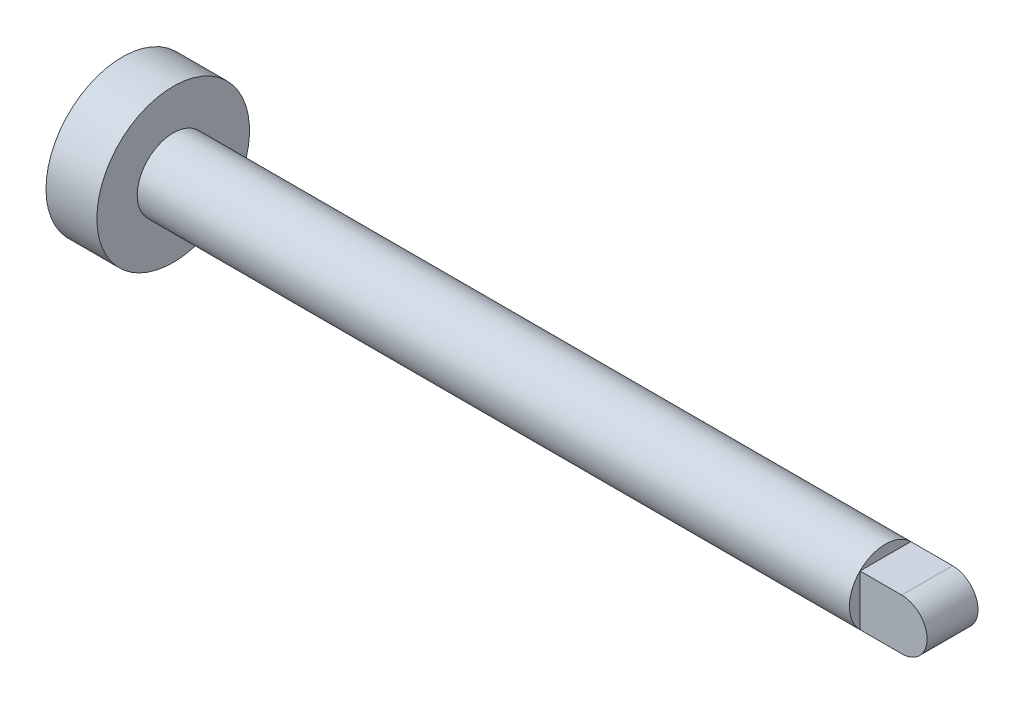
ISO-10303-21;
HEADER;
FILE_DESCRIPTION(('STEP AP214'),'2;1');
FILE_NAME('part.step','',(''),(''),'','','');
FILE_SCHEMA(('AUTOMOTIVE_DESIGN { 1 0 10303 214 1 1 1 1 }'));
ENDSEC;
DATA;
#1=APPLICATION_CONTEXT('core data for automotive mechanical design processes');
#2=APPLICATION_PROTOCOL_DEFINITION('international standard','automotive_design',2000,#1);
#3=PRODUCT_CONTEXT('',#1,'mechanical');
#4=PRODUCT('Part','Part','',(#3));
#5=PRODUCT_RELATED_PRODUCT_CATEGORY('part','',(#4));
#6=PRODUCT_DEFINITION_FORMATION('','',#4);
#7=PRODUCT_DEFINITION_CONTEXT('part definition',#1,'design');
#8=PRODUCT_DEFINITION('design','',#6,#7);
#9=PRODUCT_DEFINITION_SHAPE('','',#8);
#10=(LENGTH_UNIT() NAMED_UNIT(*) SI_UNIT(.MILLI.,.METRE.));
#11=(NAMED_UNIT(*) PLANE_ANGLE_UNIT() SI_UNIT($,.RADIAN.));
#12=(NAMED_UNIT(*) SI_UNIT($,.STERADIAN.) SOLID_ANGLE_UNIT());
#13=UNCERTAINTY_MEASURE_WITH_UNIT(LENGTH_MEASURE(1.E-05),#10,'distance_accuracy_value','');
#14=(GEOMETRIC_REPRESENTATION_CONTEXT(3) GLOBAL_UNCERTAINTY_ASSIGNED_CONTEXT((#13)) GLOBAL_UNIT_ASSIGNED_CONTEXT((#10,
#11,#12)) REPRESENTATION_CONTEXT('',''));
#15=CARTESIAN_POINT('',(0.,0.,0.));
#16=DIRECTION('',(0.,0.,1.));
#17=DIRECTION('',(1.,0.,0.));
#18=AXIS2_PLACEMENT_3D('',#15,#16,#17);
#19=CARTESIAN_POINT('',(626.400560571,150.,160.));
#20=DIRECTION('',(0.,0.,1.));
#21=DIRECTION('',(0.,-1.,0.));
#22=AXIS2_PLACEMENT_3D('',#19,#20,#21);
#23=CYLINDRICAL_SURFACE('',#22,10.);
#24=CARTESIAN_POINT('',(626.400560571,150.,160.));
#25=DIRECTION('',(0.,0.,1.));
#26=DIRECTION('',(0.,-1.,0.));
#27=AXIS2_PLACEMENT_3D('',#24,#25,#26);
#28=CIRCLE('',#27,10.);
#29=CARTESIAN_POINT('',(626.400560571,140.,160.));
#30=VERTEX_POINT('',#29);
#31=CARTESIAN_POINT('',(626.400560571,160.,160.));
#32=VERTEX_POINT('',#31);
#33=EDGE_CURVE('E98',#30,#32,#28,.T.);
#34=ORIENTED_EDGE('',*,*,#33,.T.);
#35=DIRECTION('',(0.,0.,-1.));
#36=VECTOR('',#35,1.);
#37=CARTESIAN_POINT('',(626.400560571,160.,170.));
#38=LINE('',#37,#36);
#39=CARTESIAN_POINT('',(626.400560571,160.,180.));
#40=VERTEX_POINT('',#39);
#41=EDGE_CURVE('E55',#40,#32,#38,.T.);
#42=ORIENTED_EDGE('',*,*,#41,.F.);
#43=CARTESIAN_POINT('',(626.400560571,150.,180.));
#44=DIRECTION('',(0.,0.,1.));
#45=DIRECTION('',(0.,-1.,0.));
#46=AXIS2_PLACEMENT_3D('',#43,#44,#45);
#47=CIRCLE('',#46,10.);
#48=CARTESIAN_POINT('',(626.400560571,140.,180.));
#49=VERTEX_POINT('',#48);
#50=EDGE_CURVE('E20',#49,#40,#47,.T.);
#51=ORIENTED_EDGE('',*,*,#50,.F.);
#52=DIRECTION('',(0.,0.,1.));
#53=VECTOR('',#52,1.);
#54=CARTESIAN_POINT('',(626.400560571,140.,170.));
#55=LINE('',#54,#53);
#56=EDGE_CURVE('E59',#30,#49,#55,.T.);
#57=ORIENTED_EDGE('',*,*,#56,.F.);
#58=EDGE_LOOP('',(#34,#42,#51,#57));
#59=FACE_BOUND('',#58,.T.);
#60=ADVANCED_FACE('F16',(#59),#23,.T.);
#61=CARTESIAN_POINT('',(610.,140.,180.));
#62=DIRECTION('',(0.,-1.,0.));
#63=DIRECTION('',(0.,0.,-1.));
#64=AXIS2_PLACEMENT_3D('',#61,#62,#63);
#65=PLANE('',#64);
#66=ORIENTED_EDGE('',*,*,#56,.T.);
#67=DIRECTION('',(1.,0.,0.));
#68=VECTOR('',#67,1.);
#69=CARTESIAN_POINT('',(623.279481967,140.,180.));
#70=LINE('',#69,#68);
#71=CARTESIAN_POINT('',(610.,140.000000000804,180.000000001184));
#72=VERTEX_POINT('',#71);
#73=EDGE_CURVE('E64',#72,#49,#70,.T.);
#74=ORIENTED_EDGE('',*,*,#73,.F.);
#75=DIRECTION('',(0.,0.,1.));
#76=VECTOR('',#75,1.);
#77=CARTESIAN_POINT('',(610.,140.,170.));
#78=LINE('',#77,#76);
#79=CARTESIAN_POINT('',(610.,139.99999999981,159.99999999981));
#80=VERTEX_POINT('',#79);
#81=EDGE_CURVE('E113',#80,#72,#78,.T.);
#82=ORIENTED_EDGE('',*,*,#81,.F.);
#83=DIRECTION('',(1.,0.,0.));
#84=VECTOR('',#83,1.);
#85=CARTESIAN_POINT('',(623.279481967,140.,160.));
#86=LINE('',#85,#84);
#87=EDGE_CURVE('E71',#80,#30,#86,.T.);
#88=ORIENTED_EDGE('',*,*,#87,.T.);
#89=EDGE_LOOP('',(#66,#74,#82,#88));
#90=FACE_BOUND('',#89,.T.);
#91=ADVANCED_FACE('F67',(#90),#65,.T.);
#92=CARTESIAN_POINT('',(626.400560571,160.,160.));
#93=DIRECTION('',(0.,1.,0.));
#94=DIRECTION('',(-1.,0.,0.));
#95=AXIS2_PLACEMENT_3D('',#92,#93,#94);
#96=PLANE('',#95);
#97=ORIENTED_EDGE('',*,*,#41,.T.);
#98=DIRECTION('',(-1.,0.,0.));
#99=VECTOR('',#98,1.);
#100=CARTESIAN_POINT('',(623.279481967,160.,160.));
#101=LINE('',#100,#99);
#102=CARTESIAN_POINT('',(610.,160.000000001057,160.000000000676));
#103=VERTEX_POINT('',#102);
#104=EDGE_CURVE('E99',#32,#103,#101,.T.);
#105=ORIENTED_EDGE('',*,*,#104,.T.);
#106=DIRECTION('',(0.,0.,-1.));
#107=VECTOR('',#106,1.);
#108=CARTESIAN_POINT('',(610.,160.,170.));
#109=LINE('',#108,#107);
#110=CARTESIAN_POINT('',(610.,159.999999998298,180.000000002082));
#111=VERTEX_POINT('',#110);
#112=EDGE_CURVE('E35',#111,#103,#109,.T.);
#113=ORIENTED_EDGE('',*,*,#112,.F.);
#114=DIRECTION('',(-1.,0.,0.));
#115=VECTOR('',#114,1.);
#116=CARTESIAN_POINT('',(623.279481967,160.,180.));
#117=LINE('',#116,#115);
#118=EDGE_CURVE('E63',#40,#111,#117,.T.);
#119=ORIENTED_EDGE('',*,*,#118,.F.);
#120=EDGE_LOOP('',(#97,#105,#113,#119));
#121=FACE_BOUND('',#120,.T.);
#122=ADVANCED_FACE('F124',(#121),#96,.T.);
#123=CARTESIAN_POINT('',(610.,140.,180.));
#124=DIRECTION('',(0.,0.,1.));
#125=DIRECTION('',(1.,0.,0.));
#126=AXIS2_PLACEMENT_3D('',#123,#124,#125);
#127=PLANE('',#126);
#128=ORIENTED_EDGE('',*,*,#50,.T.);
#129=ORIENTED_EDGE('',*,*,#118,.T.);
#130=DIRECTION('',(0.,1.,0.));
#131=VECTOR('',#130,1.);
#132=CARTESIAN_POINT('',(610.,150.,180.));
#133=LINE('',#132,#131);
#134=EDGE_CURVE('E75',#72,#111,#133,.T.);
#135=ORIENTED_EDGE('',*,*,#134,.F.);
#136=ORIENTED_EDGE('',*,*,#73,.T.);
#137=EDGE_LOOP('',(#128,#129,#135,#136));
#138=FACE_BOUND('',#137,.T.);
#139=ADVANCED_FACE('F73',(#138),#127,.T.);
#140=CARTESIAN_POINT('',(610.,140.,160.));
#141=DIRECTION('',(0.,0.,1.));
#142=DIRECTION('',(1.,0.,0.));
#143=AXIS2_PLACEMENT_3D('',#140,#141,#142);
#144=PLANE('',#143);
#145=DIRECTION('',(0.,-1.,0.));
#146=VECTOR('',#145,1.);
#147=CARTESIAN_POINT('',(610.,150.,160.));
#148=LINE('',#147,#146);
#149=EDGE_CURVE('E97',#103,#80,#148,.T.);
#150=ORIENTED_EDGE('',*,*,#149,.F.);
#151=ORIENTED_EDGE('',*,*,#104,.F.);
#152=ORIENTED_EDGE('',*,*,#33,.F.);
#153=ORIENTED_EDGE('',*,*,#87,.F.);
#154=EDGE_LOOP('',(#150,#151,#152,#153));
#155=FACE_BOUND('',#154,.T.);
#156=ADVANCED_FACE('F123',(#155),#144,.F.);
#157=CARTESIAN_POINT('',(610.,135.833011563,180.12));
#158=DIRECTION('',(1.,0.,0.));
#159=DIRECTION('',(0.,0.,-1.));
#160=AXIS2_PLACEMENT_3D('',#157,#158,#159);
#161=PLANE('',#160);
#162=CARTESIAN_POINT('',(610.,150.,170.));
#163=DIRECTION('',(-1.,0.,0.));
#164=DIRECTION('',(0.,-1.,0.));
#165=AXIS2_PLACEMENT_3D('',#162,#163,#164);
#166=CIRCLE('',#165,14.142135624);
#167=EDGE_CURVE('E95',#72,#80,#166,.F.);
#168=ORIENTED_EDGE('',*,*,#167,.T.);
#169=ORIENTED_EDGE('',*,*,#81,.T.);
#170=EDGE_LOOP('',(#168,#169));
#171=FACE_BOUND('',#170,.T.);
#172=ADVANCED_FACE('F112',(#171),#161,.T.);
#173=CARTESIAN_POINT('',(610.,160.,180.12));
#174=DIRECTION('',(1.,0.,0.));
#175=DIRECTION('',(0.,0.,-1.));
#176=AXIS2_PLACEMENT_3D('',#173,#174,#175);
#177=PLANE('',#176);
#178=CARTESIAN_POINT('',(610.,150.,170.));
#179=DIRECTION('',(-1.,0.,0.));
#180=DIRECTION('',(0.,-1.,0.));
#181=AXIS2_PLACEMENT_3D('',#178,#179,#180);
#182=CIRCLE('',#181,14.142135624);
#183=EDGE_CURVE('E92',#103,#111,#182,.F.);
#184=ORIENTED_EDGE('',*,*,#183,.T.);
#185=ORIENTED_EDGE('',*,*,#112,.T.);
#186=EDGE_LOOP('',(#184,#185));
#187=FACE_BOUND('',#186,.T.);
#188=ADVANCED_FACE('F102',(#187),#177,.T.);
#189=CARTESIAN_POINT('',(610.,139.88,184.166988437));
#190=DIRECTION('',(1.,0.,0.));
#191=DIRECTION('',(0.,0.,-1.));
#192=AXIS2_PLACEMENT_3D('',#189,#190,#191);
#193=PLANE('',#192);
#194=CARTESIAN_POINT('',(610.,150.,170.));
#195=DIRECTION('',(-1.,0.,0.));
#196=DIRECTION('',(0.,-1.,0.));
#197=AXIS2_PLACEMENT_3D('',#194,#195,#196);
#198=CIRCLE('',#197,14.142135624);
#199=EDGE_CURVE('E90',#111,#72,#198,.F.);
#200=ORIENTED_EDGE('',*,*,#199,.T.);
#201=ORIENTED_EDGE('',*,*,#134,.T.);
#202=EDGE_LOOP('',(#200,#201));
#203=FACE_BOUND('',#202,.T.);
#204=ADVANCED_FACE('F106',(#203),#193,.T.);
#205=CARTESIAN_POINT('',(610.,139.88,160.));
#206=DIRECTION('',(1.,0.,0.));
#207=DIRECTION('',(0.,0.,-1.));
#208=AXIS2_PLACEMENT_3D('',#205,#206,#207);
#209=PLANE('',#208);
#210=ORIENTED_EDGE('',*,*,#149,.T.);
#211=CARTESIAN_POINT('',(610.,150.,170.));
#212=DIRECTION('',(-1.,0.,0.));
#213=DIRECTION('',(0.,-1.,0.));
#214=AXIS2_PLACEMENT_3D('',#211,#212,#213);
#215=CIRCLE('',#214,14.142135624);
#216=EDGE_CURVE('E87',#80,#103,#215,.F.);
#217=ORIENTED_EDGE('',*,*,#216,.T.);
#218=EDGE_LOOP('',(#210,#217));
#219=FACE_BOUND('',#218,.T.);
#220=ADVANCED_FACE('F116',(#219),#209,.T.);
#221=CARTESIAN_POINT('',(610.,150.,170.));
#222=DIRECTION('',(-1.,0.,0.));
#223=DIRECTION('',(0.,-1.,0.));
#224=AXIS2_PLACEMENT_3D('',#221,#222,#223);
#225=CYLINDRICAL_SURFACE('',#224,14.142135624);
#226=CARTESIAN_POINT('',(330.,149.999999999999,170.));
#227=DIRECTION('',(-1.,0.,0.));
#228=DIRECTION('',(0.,-1.,0.));
#229=AXIS2_PLACEMENT_3D('',#226,#227,#228);
#230=CIRCLE('',#229,14.142135624);
#231=CARTESIAN_POINT('',(330.,135.857864375999,170.));
#232=VERTEX_POINT('',#231);
#233=EDGE_CURVE('E84',#232,#232,#230,.F.);
#234=ORIENTED_EDGE('',*,*,#233,.T.);
#235=EDGE_LOOP('',(#234));
#236=FACE_BOUND('',#235,.T.);
#237=ORIENTED_EDGE('',*,*,#216,.F.);
#238=ORIENTED_EDGE('',*,*,#167,.F.);
#239=ORIENTED_EDGE('',*,*,#199,.F.);
#240=ORIENTED_EDGE('',*,*,#183,.F.);
#241=EDGE_LOOP('',(#237,#238,#239,#240));
#242=FACE_BOUND('',#241,.T.);
#243=ADVANCED_FACE('F109',(#236,#242),#225,.T.);
#244=CARTESIAN_POINT('',(310.,119.64,200.36));
#245=DIRECTION('',(1.,0.,0.));
#246=DIRECTION('',(0.,0.,-1.));
#247=AXIS2_PLACEMENT_3D('',#244,#245,#246);
#248=PLANE('',#247);
#249=CARTESIAN_POINT('',(310.,150.,170.));
#250=DIRECTION('',(-1.,0.,0.));
#251=DIRECTION('',(0.,0.,1.));
#252=AXIS2_PLACEMENT_3D('',#249,#250,#251);
#253=CIRCLE('',#252,30.);
#254=CARTESIAN_POINT('',(310.,150.,200.));
#255=VERTEX_POINT('',#254);
#256=EDGE_CURVE('E26',#255,#255,#253,.T.);
#257=ORIENTED_EDGE('',*,*,#256,.T.);
#258=EDGE_LOOP('',(#257));
#259=FACE_BOUND('',#258,.T.);
#260=ADVANCED_FACE('F141',(#259),#248,.F.);
#261=CARTESIAN_POINT('',(330.,119.64,139.64));
#262=DIRECTION('',(-1.,0.,0.));
#263=DIRECTION('',(0.,0.,1.));
#264=AXIS2_PLACEMENT_3D('',#261,#262,#263);
#265=PLANE('',#264);
#266=ORIENTED_EDGE('',*,*,#233,.F.);
#267=EDGE_LOOP('',(#266));
#268=FACE_BOUND('',#267,.T.);
#269=CARTESIAN_POINT('',(330.,150.,170.));
#270=DIRECTION('',(-1.,0.,0.));
#271=DIRECTION('',(0.,0.,1.));
#272=AXIS2_PLACEMENT_3D('',#269,#270,#271);
#273=CIRCLE('',#272,30.);
#274=CARTESIAN_POINT('',(330.,150.,200.));
#275=VERTEX_POINT('',#274);
#276=EDGE_CURVE('E10',#275,#275,#273,.F.);
#277=ORIENTED_EDGE('',*,*,#276,.T.);
#278=EDGE_LOOP('',(#277));
#279=FACE_BOUND('',#278,.T.);
#280=ADVANCED_FACE('F18',(#268,#279),#265,.F.);
#281=CARTESIAN_POINT('',(330.,150.,170.));
#282=DIRECTION('',(-1.,0.,0.));
#283=DIRECTION('',(0.,0.,1.));
#284=AXIS2_PLACEMENT_3D('',#281,#282,#283);
#285=CYLINDRICAL_SURFACE('',#284,30.);
#286=ORIENTED_EDGE('',*,*,#256,.F.);
#287=EDGE_LOOP('',(#286));
#288=FACE_BOUND('',#287,.T.);
#289=ORIENTED_EDGE('',*,*,#276,.F.);
#290=EDGE_LOOP('',(#289));
#291=FACE_BOUND('',#290,.T.);
#292=ADVANCED_FACE('F134',(#288,#291),#285,.T.);
#293=CLOSED_SHELL('',(#60,#91,#122,#139,#156,#172,#188,#204,#220,#243,#260,#280,#292));
#294=MANIFOLD_SOLID_BREP('B1',#293);
#295=ADVANCED_BREP_SHAPE_REPRESENTATION('',(#18,#294),#14);
#296=SHAPE_DEFINITION_REPRESENTATION(#9,#295);
ENDSEC;
END-ISO-10303-21;
